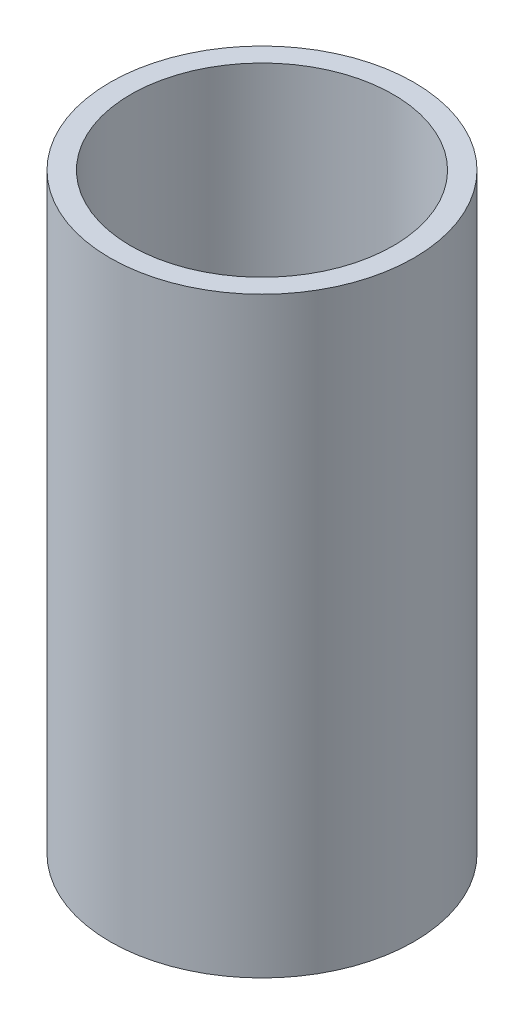
ISO-10303-21;
HEADER;
FILE_DESCRIPTION(('STEP AP214'),'2;1');
FILE_NAME('part.step','',(''),(''),'','','');
FILE_SCHEMA(('AUTOMOTIVE_DESIGN { 1 0 10303 214 1 1 1 1 }'));
ENDSEC;
DATA;
#1=APPLICATION_CONTEXT('core data for automotive mechanical design processes');
#2=APPLICATION_PROTOCOL_DEFINITION('international standard','automotive_design',2000,#1);
#3=PRODUCT_CONTEXT('',#1,'mechanical');
#4=PRODUCT('Part','Part','',(#3));
#5=PRODUCT_RELATED_PRODUCT_CATEGORY('part','',(#4));
#6=PRODUCT_DEFINITION_FORMATION('','',#4);
#7=PRODUCT_DEFINITION_CONTEXT('part definition',#1,'design');
#8=PRODUCT_DEFINITION('design','',#6,#7);
#9=PRODUCT_DEFINITION_SHAPE('','',#8);
#10=(LENGTH_UNIT() NAMED_UNIT(*) SI_UNIT(.MILLI.,.METRE.));
#11=(NAMED_UNIT(*) PLANE_ANGLE_UNIT() SI_UNIT($,.RADIAN.));
#12=(NAMED_UNIT(*) SI_UNIT($,.STERADIAN.) SOLID_ANGLE_UNIT());
#13=UNCERTAINTY_MEASURE_WITH_UNIT(LENGTH_MEASURE(1.E-05),#10,'distance_accuracy_value','');
#14=(GEOMETRIC_REPRESENTATION_CONTEXT(3) GLOBAL_UNCERTAINTY_ASSIGNED_CONTEXT((#13)) GLOBAL_UNIT_ASSIGNED_CONTEXT((#10,
#11,#12)) REPRESENTATION_CONTEXT('',''));
#15=CARTESIAN_POINT('',(0.,0.,0.));
#16=DIRECTION('',(0.,0.,1.));
#17=DIRECTION('',(1.,0.,0.));
#18=AXIS2_PLACEMENT_3D('',#15,#16,#17);
#19=CARTESIAN_POINT('',(0.,18.5,0.));
#20=DIRECTION('',(0.,1.,0.));
#21=DIRECTION('',(0.,0.,1.));
#22=AXIS2_PLACEMENT_3D('',#19,#20,#21);
#23=PLANE('',#22);
#24=CARTESIAN_POINT('',(0.,18.5,0.));
#25=DIRECTION('',(0.,1.,0.));
#26=DIRECTION('',(0.,0.,1.));
#27=AXIS2_PLACEMENT_3D('',#24,#25,#26);
#28=CIRCLE('',#27,4.75);
#29=CARTESIAN_POINT('',(0.,18.5,4.75));
#30=VERTEX_POINT('',#29);
#31=EDGE_CURVE('E10',#30,#30,#28,.T.);
#32=ORIENTED_EDGE('',*,*,#31,.T.);
#33=EDGE_LOOP('',(#32));
#34=FACE_BOUND('',#33,.T.);
#35=CARTESIAN_POINT('',(0.,18.5,0.));
#36=DIRECTION('',(0.,1.,0.));
#37=DIRECTION('',(0.,0.,1.));
#38=AXIS2_PLACEMENT_3D('',#35,#36,#37);
#39=CIRCLE('',#38,4.1);
#40=CARTESIAN_POINT('',(0.,18.5,4.1));
#41=VERTEX_POINT('',#40);
#42=EDGE_CURVE('E52',#41,#41,#39,.T.);
#43=ORIENTED_EDGE('',*,*,#42,.F.);
#44=EDGE_LOOP('',(#43));
#45=FACE_BOUND('',#44,.T.);
#46=ADVANCED_FACE('F41',(#34,#45),#23,.T.);
#47=CARTESIAN_POINT('',(0.,0.,0.));
#48=DIRECTION('',(0.,1.,0.));
#49=DIRECTION('',(0.,0.,1.));
#50=AXIS2_PLACEMENT_3D('',#47,#48,#49);
#51=PLANE('',#50);
#52=CARTESIAN_POINT('',(0.,0.,0.));
#53=DIRECTION('',(0.,1.,0.));
#54=DIRECTION('',(0.,0.,1.));
#55=AXIS2_PLACEMENT_3D('',#52,#53,#54);
#56=CIRCLE('',#55,4.75);
#57=CARTESIAN_POINT('',(0.,0.,4.75));
#58=VERTEX_POINT('',#57);
#59=EDGE_CURVE('E45',#58,#58,#56,.T.);
#60=ORIENTED_EDGE('',*,*,#59,.F.);
#61=EDGE_LOOP('',(#60));
#62=FACE_BOUND('',#61,.T.);
#63=CARTESIAN_POINT('',(0.,0.,0.));
#64=DIRECTION('',(0.,1.,0.));
#65=DIRECTION('',(0.,0.,1.));
#66=AXIS2_PLACEMENT_3D('',#63,#64,#65);
#67=CIRCLE('',#66,4.1);
#68=CARTESIAN_POINT('',(0.,0.,4.1));
#69=VERTEX_POINT('',#68);
#70=EDGE_CURVE('E54',#69,#69,#67,.T.);
#71=ORIENTED_EDGE('',*,*,#70,.T.);
#72=EDGE_LOOP('',(#71));
#73=FACE_BOUND('',#72,.T.);
#74=ADVANCED_FACE('F64',(#62,#73),#51,.F.);
#75=CARTESIAN_POINT('',(0.,18.5,0.));
#76=DIRECTION('',(0.,-1.,0.));
#77=DIRECTION('',(0.,0.,-1.));
#78=AXIS2_PLACEMENT_3D('',#75,#76,#77);
#79=CYLINDRICAL_SURFACE('',#78,4.75);
#80=ORIENTED_EDGE('',*,*,#31,.F.);
#81=EDGE_LOOP('',(#80));
#82=FACE_BOUND('',#81,.T.);
#83=ORIENTED_EDGE('',*,*,#59,.T.);
#84=EDGE_LOOP('',(#83));
#85=FACE_BOUND('',#84,.T.);
#86=ADVANCED_FACE('F43',(#82,#85),#79,.T.);
#87=CARTESIAN_POINT('',(0.,18.5,0.));
#88=DIRECTION('',(0.,-1.,0.));
#89=DIRECTION('',(0.,0.,-1.));
#90=AXIS2_PLACEMENT_3D('',#87,#88,#89);
#91=CYLINDRICAL_SURFACE('',#90,4.1);
#92=ORIENTED_EDGE('',*,*,#42,.T.);
#93=EDGE_LOOP('',(#92));
#94=FACE_BOUND('',#93,.T.);
#95=ORIENTED_EDGE('',*,*,#70,.F.);
#96=EDGE_LOOP('',(#95));
#97=FACE_BOUND('',#96,.T.);
#98=ADVANCED_FACE('F60',(#94,#97),#91,.F.);
#99=CLOSED_SHELL('',(#46,#74,#86,#98));
#100=MANIFOLD_SOLID_BREP('B2',#99);
#101=ADVANCED_BREP_SHAPE_REPRESENTATION('',(#18,#100),#14);
#102=SHAPE_DEFINITION_REPRESENTATION(#9,#101);
ENDSEC;
END-ISO-10303-21;
